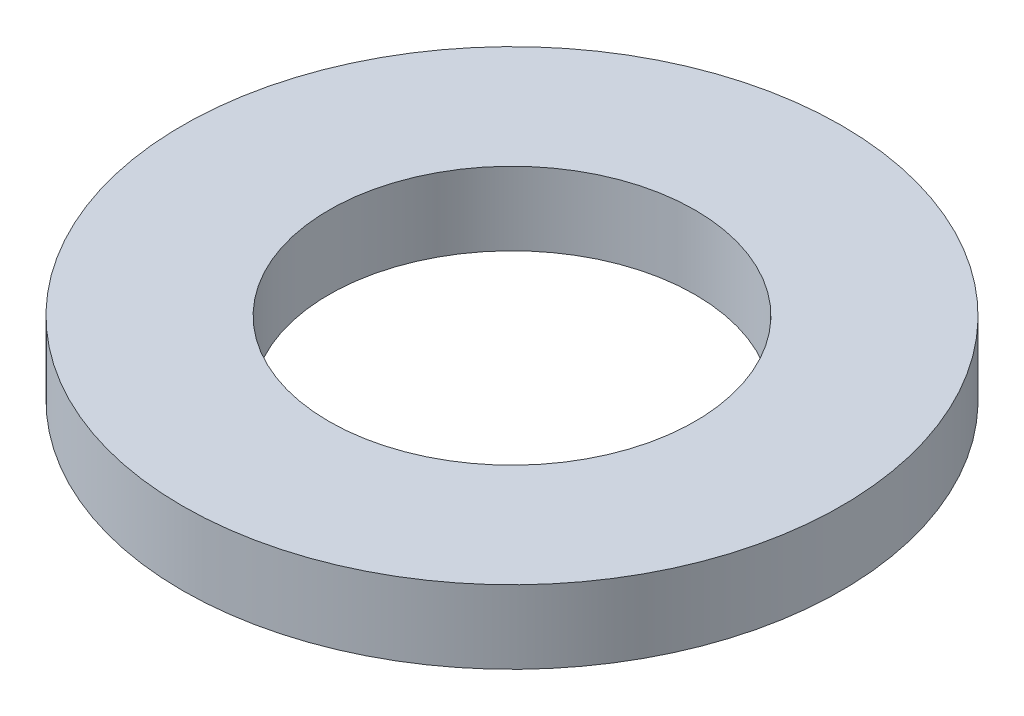
ISO-10303-21;
HEADER;
FILE_DESCRIPTION(('STEP AP214'),'2;1');
FILE_NAME('part.step','',(''),(''),'','','');
FILE_SCHEMA(('AUTOMOTIVE_DESIGN { 1 0 10303 214 1 1 1 1 }'));
ENDSEC;
DATA;
#1=APPLICATION_CONTEXT('core data for automotive mechanical design processes');
#2=APPLICATION_PROTOCOL_DEFINITION('international standard','automotive_design',2000,#1);
#3=PRODUCT_CONTEXT('',#1,'mechanical');
#4=PRODUCT('Part','Part','',(#3));
#5=PRODUCT_RELATED_PRODUCT_CATEGORY('part','',(#4));
#6=PRODUCT_DEFINITION_FORMATION('','',#4);
#7=PRODUCT_DEFINITION_CONTEXT('part definition',#1,'design');
#8=PRODUCT_DEFINITION('design','',#6,#7);
#9=PRODUCT_DEFINITION_SHAPE('','',#8);
#10=(LENGTH_UNIT() NAMED_UNIT(*) SI_UNIT(.MILLI.,.METRE.));
#11=(NAMED_UNIT(*) PLANE_ANGLE_UNIT() SI_UNIT($,.RADIAN.));
#12=(NAMED_UNIT(*) SI_UNIT($,.STERADIAN.) SOLID_ANGLE_UNIT());
#13=UNCERTAINTY_MEASURE_WITH_UNIT(LENGTH_MEASURE(1.E-05),#10,'distance_accuracy_value','');
#14=(GEOMETRIC_REPRESENTATION_CONTEXT(3) GLOBAL_UNCERTAINTY_ASSIGNED_CONTEXT((#13)) GLOBAL_UNIT_ASSIGNED_CONTEXT((#10,
#11,#12)) REPRESENTATION_CONTEXT('',''));
#15=CARTESIAN_POINT('',(0.,0.,0.));
#16=DIRECTION('',(0.,0.,1.));
#17=DIRECTION('',(1.,0.,0.));
#18=AXIS2_PLACEMENT_3D('',#15,#16,#17);
#19=CARTESIAN_POINT('',(0.,1.,0.));
#20=DIRECTION('',(0.,1.,0.));
#21=DIRECTION('',(0.,0.,1.));
#22=AXIS2_PLACEMENT_3D('',#19,#20,#21);
#23=PLANE('',#22);
#24=CARTESIAN_POINT('',(0.,1.,0.));
#25=DIRECTION('',(0.,1.,0.));
#26=DIRECTION('',(0.,0.,1.));
#27=AXIS2_PLACEMENT_3D('',#24,#25,#26);
#28=CIRCLE('',#27,4.5);
#29=CARTESIAN_POINT('',(0.,1.,4.5));
#30=VERTEX_POINT('',#29);
#31=EDGE_CURVE('E10',#30,#30,#28,.T.);
#32=ORIENTED_EDGE('',*,*,#31,.T.);
#33=EDGE_LOOP('',(#32));
#34=FACE_BOUND('',#33,.T.);
#35=CARTESIAN_POINT('',(0.,1.,0.));
#36=DIRECTION('',(0.,1.,0.));
#37=DIRECTION('',(0.,0.,1.));
#38=AXIS2_PLACEMENT_3D('',#35,#36,#37);
#39=CIRCLE('',#38,2.5);
#40=CARTESIAN_POINT('',(0.,1.,2.5));
#41=VERTEX_POINT('',#40);
#42=EDGE_CURVE('E54',#41,#41,#39,.T.);
#43=ORIENTED_EDGE('',*,*,#42,.F.);
#44=EDGE_LOOP('',(#43));
#45=FACE_BOUND('',#44,.T.);
#46=ADVANCED_FACE('F41',(#34,#45),#23,.T.);
#47=CARTESIAN_POINT('',(0.,0.,0.));
#48=DIRECTION('',(0.,1.,0.));
#49=DIRECTION('',(0.,0.,1.));
#50=AXIS2_PLACEMENT_3D('',#47,#48,#49);
#51=PLANE('',#50);
#52=CARTESIAN_POINT('',(0.,0.,0.));
#53=DIRECTION('',(0.,1.,0.));
#54=DIRECTION('',(0.,0.,1.));
#55=AXIS2_PLACEMENT_3D('',#52,#53,#54);
#56=CIRCLE('',#55,4.5);
#57=CARTESIAN_POINT('',(0.,0.,4.5));
#58=VERTEX_POINT('',#57);
#59=EDGE_CURVE('E45',#58,#58,#56,.T.);
#60=ORIENTED_EDGE('',*,*,#59,.F.);
#61=EDGE_LOOP('',(#60));
#62=FACE_BOUND('',#61,.T.);
#63=CARTESIAN_POINT('',(0.,0.,0.));
#64=DIRECTION('',(0.,1.,0.));
#65=DIRECTION('',(0.,0.,1.));
#66=AXIS2_PLACEMENT_3D('',#63,#64,#65);
#67=CIRCLE('',#66,2.5);
#68=CARTESIAN_POINT('',(0.,0.,2.5));
#69=VERTEX_POINT('',#68);
#70=EDGE_CURVE('E56',#69,#69,#67,.T.);
#71=ORIENTED_EDGE('',*,*,#70,.T.);
#72=EDGE_LOOP('',(#71));
#73=FACE_BOUND('',#72,.T.);
#74=ADVANCED_FACE('F68',(#62,#73),#51,.F.);
#75=CARTESIAN_POINT('',(0.,1.,0.));
#76=DIRECTION('',(0.,-1.,0.));
#77=DIRECTION('',(0.,0.,-1.));
#78=AXIS2_PLACEMENT_3D('',#75,#76,#77);
#79=CYLINDRICAL_SURFACE('',#78,4.5);
#80=ORIENTED_EDGE('',*,*,#31,.F.);
#81=EDGE_LOOP('',(#80));
#82=FACE_BOUND('',#81,.T.);
#83=ORIENTED_EDGE('',*,*,#59,.T.);
#84=EDGE_LOOP('',(#83));
#85=FACE_BOUND('',#84,.T.);
#86=ADVANCED_FACE('F43',(#82,#85),#79,.T.);
#87=CARTESIAN_POINT('',(0.,1.,0.));
#88=DIRECTION('',(0.,-1.,0.));
#89=DIRECTION('',(0.,0.,-1.));
#90=AXIS2_PLACEMENT_3D('',#87,#88,#89);
#91=CYLINDRICAL_SURFACE('',#90,2.5);
#92=ORIENTED_EDGE('',*,*,#42,.T.);
#93=EDGE_LOOP('',(#92));
#94=FACE_BOUND('',#93,.T.);
#95=ORIENTED_EDGE('',*,*,#70,.F.);
#96=EDGE_LOOP('',(#95));
#97=FACE_BOUND('',#96,.T.);
#98=ADVANCED_FACE('F64',(#94,#97),#91,.F.);
#99=CLOSED_SHELL('',(#46,#74,#86,#98));
#100=MANIFOLD_SOLID_BREP('B2',#99);
#101=ADVANCED_BREP_SHAPE_REPRESENTATION('',(#18,#100),#14);
#102=SHAPE_DEFINITION_REPRESENTATION(#9,#101);
ENDSEC;
END-ISO-10303-21;
